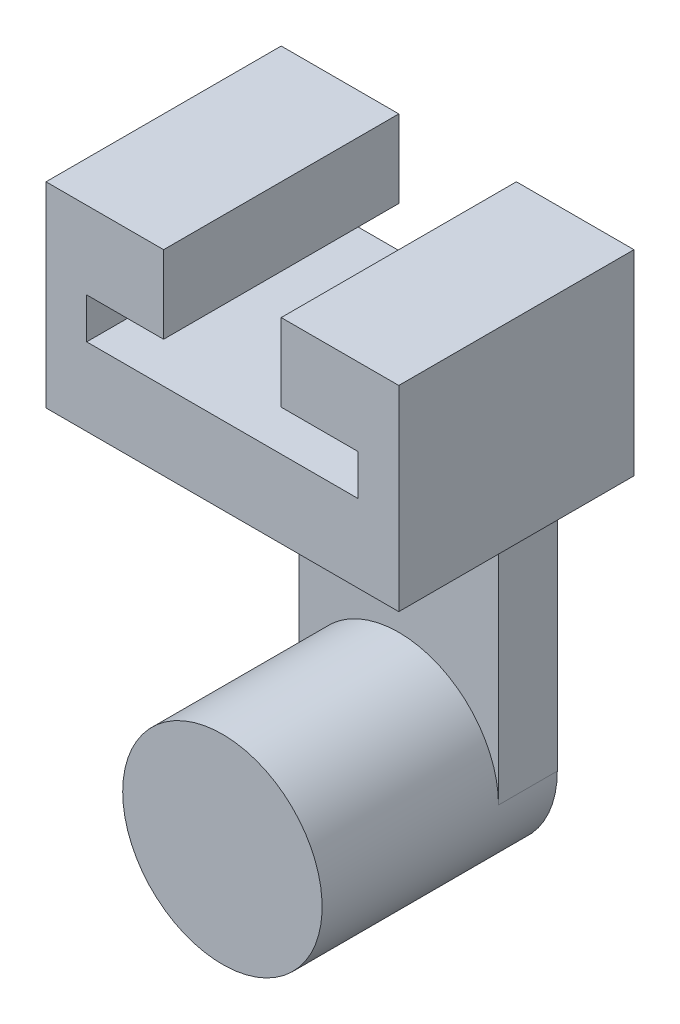
ISO-10303-21;
HEADER;
FILE_DESCRIPTION(('STEP AP214'),'2;1');
FILE_NAME('part.step','',(''),(''),'','','');
FILE_SCHEMA(('AUTOMOTIVE_DESIGN { 1 0 10303 214 1 1 1 1 }'));
ENDSEC;
DATA;
#1=APPLICATION_CONTEXT('core data for automotive mechanical design processes');
#2=APPLICATION_PROTOCOL_DEFINITION('international standard','automotive_design',2000,#1);
#3=PRODUCT_CONTEXT('',#1,'mechanical');
#4=PRODUCT('Part','Part','',(#3));
#5=PRODUCT_RELATED_PRODUCT_CATEGORY('part','',(#4));
#6=PRODUCT_DEFINITION_FORMATION('','',#4);
#7=PRODUCT_DEFINITION_CONTEXT('part definition',#1,'design');
#8=PRODUCT_DEFINITION('design','',#6,#7);
#9=PRODUCT_DEFINITION_SHAPE('','',#8);
#10=(LENGTH_UNIT() NAMED_UNIT(*) SI_UNIT(.MILLI.,.METRE.));
#11=(NAMED_UNIT(*) PLANE_ANGLE_UNIT() SI_UNIT($,.RADIAN.));
#12=(NAMED_UNIT(*) SI_UNIT($,.STERADIAN.) SOLID_ANGLE_UNIT());
#13=UNCERTAINTY_MEASURE_WITH_UNIT(LENGTH_MEASURE(1.E-05),#10,'distance_accuracy_value','');
#14=(GEOMETRIC_REPRESENTATION_CONTEXT(3) GLOBAL_UNCERTAINTY_ASSIGNED_CONTEXT((#13)) GLOBAL_UNIT_ASSIGNED_CONTEXT((#10,
#11,#12)) REPRESENTATION_CONTEXT('',''));
#15=CARTESIAN_POINT('',(0.,0.,0.));
#16=DIRECTION('',(0.,0.,1.));
#17=DIRECTION('',(1.,0.,0.));
#18=AXIS2_PLACEMENT_3D('',#15,#16,#17);
#19=CARTESIAN_POINT('',(-29.8196,0.,6.35));
#20=DIRECTION('',(-1.,0.,0.));
#21=DIRECTION('',(0.,-1.,0.));
#22=AXIS2_PLACEMENT_3D('',#19,#20,#21);
#23=PLANE('',#22);
#24=DIRECTION('',(0.,1.,0.));
#25=VECTOR('',#24,1.);
#26=CARTESIAN_POINT('',(-29.8196,0.,0.));
#27=LINE('',#26,#25);
#28=CARTESIAN_POINT('',(-29.8196,-31.75,0.));
#29=VERTEX_POINT('',#28);
#30=CARTESIAN_POINT('',(-29.8196,0.,0.));
#31=VERTEX_POINT('',#30);
#32=EDGE_CURVE('E84',#29,#31,#27,.T.);
#33=ORIENTED_EDGE('',*,*,#32,.F.);
#34=DIRECTION('',(0.,0.,-1.));
#35=VECTOR('',#34,1.);
#36=CARTESIAN_POINT('',(-29.8196,-31.75,6.35));
#37=LINE('',#36,#35);
#38=CARTESIAN_POINT('',(-29.8196,-31.75,6.35));
#39=VERTEX_POINT('',#38);
#40=EDGE_CURVE('E56',#39,#29,#37,.T.);
#41=ORIENTED_EDGE('',*,*,#40,.F.);
#42=DIRECTION('',(0.,1.,0.));
#43=VECTOR('',#42,1.);
#44=CARTESIAN_POINT('',(-29.8196,0.,6.35));
#45=LINE('',#44,#43);
#46=CARTESIAN_POINT('',(-29.8196,0.,6.35));
#47=VERTEX_POINT('',#46);
#48=EDGE_CURVE('E292',#39,#47,#45,.T.);
#49=ORIENTED_EDGE('',*,*,#48,.T.);
#50=DIRECTION('',(0.,0.,-1.));
#51=VECTOR('',#50,1.);
#52=CARTESIAN_POINT('',(-29.8196,0.,6.35));
#53=LINE('',#52,#51);
#54=EDGE_CURVE('E11',#47,#31,#53,.T.);
#55=ORIENTED_EDGE('',*,*,#54,.T.);
#56=EDGE_LOOP('',(#33,#41,#49,#55));
#57=FACE_BOUND('',#56,.T.);
#58=ADVANCED_FACE('F47',(#57),#23,.T.);
#59=CARTESIAN_POINT('',(-8.28040000000001,0.,6.35));
#60=DIRECTION('',(1.,0.,0.));
#61=DIRECTION('',(0.,1.,0.));
#62=AXIS2_PLACEMENT_3D('',#59,#60,#61);
#63=PLANE('',#62);
#64=DIRECTION('',(0.,-1.,0.));
#65=VECTOR('',#64,1.);
#66=CARTESIAN_POINT('',(-8.28040000000001,0.,0.));
#67=LINE('',#66,#65);
#68=CARTESIAN_POINT('',(-8.28040000000001,0.,0.));
#69=VERTEX_POINT('',#68);
#70=CARTESIAN_POINT('',(-8.2804,-31.75,0.));
#71=VERTEX_POINT('',#70);
#72=EDGE_CURVE('E287',#69,#71,#67,.T.);
#73=ORIENTED_EDGE('',*,*,#72,.F.);
#74=DIRECTION('',(0.,0.,-1.));
#75=VECTOR('',#74,1.);
#76=CARTESIAN_POINT('',(-8.28040000000001,0.,6.35));
#77=LINE('',#76,#75);
#78=CARTESIAN_POINT('',(-8.28040000000001,0.,6.35));
#79=VERTEX_POINT('',#78);
#80=EDGE_CURVE('E52',#79,#69,#77,.T.);
#81=ORIENTED_EDGE('',*,*,#80,.F.);
#82=DIRECTION('',(0.,-1.,0.));
#83=VECTOR('',#82,1.);
#84=CARTESIAN_POINT('',(-8.28040000000001,0.,6.35));
#85=LINE('',#84,#83);
#86=CARTESIAN_POINT('',(-8.2804,-31.75,6.35));
#87=VERTEX_POINT('',#86);
#88=EDGE_CURVE('E286',#79,#87,#85,.T.);
#89=ORIENTED_EDGE('',*,*,#88,.T.);
#90=DIRECTION('',(0.,0.,-1.));
#91=VECTOR('',#90,1.);
#92=CARTESIAN_POINT('',(-8.2804,-31.75,6.35));
#93=LINE('',#92,#91);
#94=EDGE_CURVE('E298',#87,#71,#93,.T.);
#95=ORIENTED_EDGE('',*,*,#94,.T.);
#96=EDGE_LOOP('',(#73,#81,#89,#95));
#97=FACE_BOUND('',#96,.T.);
#98=ADVANCED_FACE('F51',(#97),#63,.T.);
#99=CARTESIAN_POINT('',(0.,0.,6.35));
#100=DIRECTION('',(0.,0.,1.));
#101=DIRECTION('',(1.,0.,0.));
#102=AXIS2_PLACEMENT_3D('',#99,#100,#101);
#103=PLANE('',#102);
#104=CARTESIAN_POINT('',(-19.05,-31.75,6.35));
#105=DIRECTION('',(0.,0.,1.));
#106=DIRECTION('',(1.,0.,0.));
#107=AXIS2_PLACEMENT_3D('',#104,#105,#106);
#108=CIRCLE('',#107,10.7696);
#109=EDGE_CURVE('E282',#87,#39,#108,.T.);
#110=ORIENTED_EDGE('',*,*,#109,.F.);
#111=ORIENTED_EDGE('',*,*,#88,.F.);
#112=DIRECTION('',(1.,0.,0.));
#113=VECTOR('',#112,1.);
#114=CARTESIAN_POINT('',(-8.28040000000001,0.,6.35));
#115=LINE('',#114,#113);
#116=EDGE_CURVE('E67',#47,#79,#115,.T.);
#117=ORIENTED_EDGE('',*,*,#116,.F.);
#118=ORIENTED_EDGE('',*,*,#48,.F.);
#119=EDGE_LOOP('',(#110,#111,#117,#118));
#120=FACE_BOUND('',#119,.T.);
#121=ADVANCED_FACE('F323',(#120),#103,.T.);
#122=CARTESIAN_POINT('',(0.,0.,0.));
#123=DIRECTION('',(0.,0.,1.));
#124=DIRECTION('',(1.,0.,0.));
#125=AXIS2_PLACEMENT_3D('',#122,#123,#124);
#126=PLANE('',#125);
#127=ORIENTED_EDGE('',*,*,#72,.T.);
#128=CARTESIAN_POINT('',(-19.05,-31.75,0.));
#129=DIRECTION('',(0.,0.,-1.));
#130=DIRECTION('',(-1.,0.,0.));
#131=AXIS2_PLACEMENT_3D('',#128,#129,#130);
#132=CIRCLE('',#131,10.7696);
#133=EDGE_CURVE('E276',#71,#29,#132,.T.);
#134=ORIENTED_EDGE('',*,*,#133,.T.);
#135=ORIENTED_EDGE('',*,*,#32,.T.);
#136=DIRECTION('',(1.,0.,0.));
#137=VECTOR('',#136,1.);
#138=CARTESIAN_POINT('',(0.,0.,0.));
#139=LINE('',#138,#137);
#140=CARTESIAN_POINT('',(-38.1,0.,0.));
#141=VERTEX_POINT('',#140);
#142=EDGE_CURVE('E260',#141,#31,#139,.T.);
#143=ORIENTED_EDGE('',*,*,#142,.F.);
#144=DIRECTION('',(0.,-1.,0.));
#145=VECTOR('',#144,1.);
#146=CARTESIAN_POINT('',(-38.1,0.,0.));
#147=LINE('',#146,#145);
#148=CARTESIAN_POINT('',(-38.1,21.1582,0.));
#149=VERTEX_POINT('',#148);
#150=EDGE_CURVE('E270',#149,#141,#147,.T.);
#151=ORIENTED_EDGE('',*,*,#150,.F.);
#152=DIRECTION('',(-1.,0.,0.));
#153=VECTOR('',#152,1.);
#154=CARTESIAN_POINT('',(-38.1,21.1582,0.));
#155=LINE('',#154,#153);
#156=CARTESIAN_POINT('',(-25.4,21.1582,0.));
#157=VERTEX_POINT('',#156);
#158=EDGE_CURVE('E188',#157,#149,#155,.T.);
#159=ORIENTED_EDGE('',*,*,#158,.F.);
#160=DIRECTION('',(0.,1.,0.));
#161=VECTOR('',#160,1.);
#162=CARTESIAN_POINT('',(-25.4,12.7762,0.));
#163=LINE('',#162,#161);
#164=CARTESIAN_POINT('',(-25.4,12.7762,0.));
#165=VERTEX_POINT('',#164);
#166=EDGE_CURVE('E179',#165,#157,#163,.T.);
#167=ORIENTED_EDGE('',*,*,#166,.F.);
#168=DIRECTION('',(1.,0.,0.));
#169=VECTOR('',#168,1.);
#170=CARTESIAN_POINT('',(-38.1,12.7762,0.));
#171=LINE('',#170,#169);
#172=CARTESIAN_POINT('',(-33.7058,12.7762,0.));
#173=VERTEX_POINT('',#172);
#174=EDGE_CURVE('E169',#173,#165,#171,.T.);
#175=ORIENTED_EDGE('',*,*,#174,.F.);
#176=DIRECTION('',(0.,1.,0.));
#177=VECTOR('',#176,1.);
#178=CARTESIAN_POINT('',(-33.7058,8.382,0.));
#179=LINE('',#178,#177);
#180=CARTESIAN_POINT('',(-33.7058,8.382,0.));
#181=VERTEX_POINT('',#180);
#182=EDGE_CURVE('E231',#181,#173,#179,.T.);
#183=ORIENTED_EDGE('',*,*,#182,.F.);
#184=DIRECTION('',(-1.,0.,0.));
#185=VECTOR('',#184,1.);
#186=CARTESIAN_POINT('',(0.,8.382,0.));
#187=LINE('',#186,#185);
#188=CARTESIAN_POINT('',(-4.3942,8.382,0.));
#189=VERTEX_POINT('',#188);
#190=EDGE_CURVE('E268',#189,#181,#187,.T.);
#191=ORIENTED_EDGE('',*,*,#190,.F.);
#192=DIRECTION('',(0.,-1.,0.));
#193=VECTOR('',#192,1.);
#194=CARTESIAN_POINT('',(-4.3942,8.382,0.));
#195=LINE('',#194,#193);
#196=CARTESIAN_POINT('',(-4.3942,12.7762,0.));
#197=VERTEX_POINT('',#196);
#198=EDGE_CURVE('E250',#197,#189,#195,.T.);
#199=ORIENTED_EDGE('',*,*,#198,.F.);
#200=DIRECTION('',(1.,0.,0.));
#201=VECTOR('',#200,1.);
#202=CARTESIAN_POINT('',(0.,12.7762,0.));
#203=LINE('',#202,#201);
#204=CARTESIAN_POINT('',(-12.7,12.7762,0.));
#205=VERTEX_POINT('',#204);
#206=EDGE_CURVE('E215',#205,#197,#203,.T.);
#207=ORIENTED_EDGE('',*,*,#206,.F.);
#208=DIRECTION('',(0.,-1.,0.));
#209=VECTOR('',#208,1.);
#210=CARTESIAN_POINT('',(-12.7,12.7762,0.));
#211=LINE('',#210,#209);
#212=CARTESIAN_POINT('',(-12.7,21.1582,0.));
#213=VERTEX_POINT('',#212);
#214=EDGE_CURVE('E226',#213,#205,#211,.T.);
#215=ORIENTED_EDGE('',*,*,#214,.F.);
#216=DIRECTION('',(-1.,0.,0.));
#217=VECTOR('',#216,1.);
#218=CARTESIAN_POINT('',(0.,21.1582,0.));
#219=LINE('',#218,#217);
#220=CARTESIAN_POINT('',(0.,21.1582,0.));
#221=VERTEX_POINT('',#220);
#222=EDGE_CURVE('E223',#221,#213,#219,.T.);
#223=ORIENTED_EDGE('',*,*,#222,.F.);
#224=DIRECTION('',(0.,1.,0.));
#225=VECTOR('',#224,1.);
#226=CARTESIAN_POINT('',(0.,0.,0.));
#227=LINE('',#226,#225);
#228=CARTESIAN_POINT('',(0.,0.,0.));
#229=VERTEX_POINT('',#228);
#230=EDGE_CURVE('E241',#229,#221,#227,.T.);
#231=ORIENTED_EDGE('',*,*,#230,.F.);
#232=EDGE_CURVE('E272',#69,#229,#139,.T.);
#233=ORIENTED_EDGE('',*,*,#232,.F.);
#234=EDGE_LOOP('',(#127,#134,#135,#143,#151,#159,#167,#175,#183,#191,#199,#207,#215,#223,#231,#233));
#235=FACE_BOUND('',#234,.T.);
#236=ADVANCED_FACE('F194',(#235),#126,.F.);
#237=CARTESIAN_POINT('',(-19.05,-31.75,25.4));
#238=DIRECTION('',(0.,0.,-1.));
#239=DIRECTION('',(-1.,0.,0.));
#240=AXIS2_PLACEMENT_3D('',#237,#238,#239);
#241=CYLINDRICAL_SURFACE('',#240,10.7696);
#242=ORIENTED_EDGE('',*,*,#109,.T.);
#243=ORIENTED_EDGE('',*,*,#40,.T.);
#244=ORIENTED_EDGE('',*,*,#133,.F.);
#245=ORIENTED_EDGE('',*,*,#94,.F.);
#246=EDGE_LOOP('',(#242,#243,#244,#245));
#247=FACE_BOUND('',#246,.T.);
#248=CARTESIAN_POINT('',(-19.05,-31.75,25.4));
#249=DIRECTION('',(0.,0.,-1.));
#250=DIRECTION('',(-1.,0.,0.));
#251=AXIS2_PLACEMENT_3D('',#248,#249,#250);
#252=CIRCLE('',#251,10.7696);
#253=CARTESIAN_POINT('',(-29.8196,-31.75,25.4));
#254=VERTEX_POINT('',#253);
#255=EDGE_CURVE('E278',#254,#254,#252,.T.);
#256=ORIENTED_EDGE('',*,*,#255,.T.);
#257=EDGE_LOOP('',(#256));
#258=FACE_BOUND('',#257,.T.);
#259=ADVANCED_FACE('F324',(#247,#258),#241,.T.);
#260=CARTESIAN_POINT('',(-19.05,-31.75,25.4));
#261=DIRECTION('',(0.,0.,-1.));
#262=DIRECTION('',(-1.,0.,0.));
#263=AXIS2_PLACEMENT_3D('',#260,#261,#262);
#264=PLANE('',#263);
#265=ORIENTED_EDGE('',*,*,#255,.F.);
#266=EDGE_LOOP('',(#265));
#267=FACE_BOUND('',#266,.T.);
#268=ADVANCED_FACE('F340',(#267),#264,.F.);
#269=CARTESIAN_POINT('',(0.,8.382,25.4));
#270=DIRECTION('',(0.,-1.,0.));
#271=DIRECTION('',(1.,0.,0.));
#272=AXIS2_PLACEMENT_3D('',#269,#270,#271);
#273=PLANE('',#272);
#274=ORIENTED_EDGE('',*,*,#190,.T.);
#275=DIRECTION('',(0.,0.,1.));
#276=VECTOR('',#275,1.);
#277=CARTESIAN_POINT('',(-33.7058,8.382,0.));
#278=LINE('',#277,#276);
#279=CARTESIAN_POINT('',(-33.7058,8.382,25.4));
#280=VERTEX_POINT('',#279);
#281=EDGE_CURVE('E232',#181,#280,#278,.T.);
#282=ORIENTED_EDGE('',*,*,#281,.T.);
#283=DIRECTION('',(-1.,0.,0.));
#284=VECTOR('',#283,1.);
#285=CARTESIAN_POINT('',(0.,8.382,25.4));
#286=LINE('',#285,#284);
#287=CARTESIAN_POINT('',(-4.3942,8.382,25.4));
#288=VERTEX_POINT('',#287);
#289=EDGE_CURVE('E257',#288,#280,#286,.T.);
#290=ORIENTED_EDGE('',*,*,#289,.F.);
#291=DIRECTION('',(0.,0.,1.));
#292=VECTOR('',#291,1.);
#293=CARTESIAN_POINT('',(-4.3942,8.382,0.));
#294=LINE('',#293,#292);
#295=EDGE_CURVE('E210',#189,#288,#294,.T.);
#296=ORIENTED_EDGE('',*,*,#295,.F.);
#297=EDGE_LOOP('',(#274,#282,#290,#296));
#298=FACE_BOUND('',#297,.T.);
#299=ADVANCED_FACE('F338',(#298),#273,.F.);
#300=CARTESIAN_POINT('',(0.,0.,25.4));
#301=DIRECTION('',(-1.,0.,0.));
#302=DIRECTION('',(0.,0.,1.));
#303=AXIS2_PLACEMENT_3D('',#300,#301,#302);
#304=PLANE('',#303);
#305=ORIENTED_EDGE('',*,*,#230,.T.);
#306=DIRECTION('',(0.,0.,1.));
#307=VECTOR('',#306,1.);
#308=CARTESIAN_POINT('',(0.,21.1582,0.));
#309=LINE('',#308,#307);
#310=CARTESIAN_POINT('',(0.,21.1582,25.4));
#311=VERTEX_POINT('',#310);
#312=EDGE_CURVE('E209',#221,#311,#309,.T.);
#313=ORIENTED_EDGE('',*,*,#312,.T.);
#314=DIRECTION('',(0.,1.,0.));
#315=VECTOR('',#314,1.);
#316=CARTESIAN_POINT('',(0.,0.,25.4));
#317=LINE('',#316,#315);
#318=CARTESIAN_POINT('',(0.,0.,25.4));
#319=VERTEX_POINT('',#318);
#320=EDGE_CURVE('E251',#319,#311,#317,.T.);
#321=ORIENTED_EDGE('',*,*,#320,.F.);
#322=DIRECTION('',(0.,0.,-1.));
#323=VECTOR('',#322,1.);
#324=CARTESIAN_POINT('',(0.,0.,25.4));
#325=LINE('',#324,#323);
#326=EDGE_CURVE('E265',#319,#229,#325,.T.);
#327=ORIENTED_EDGE('',*,*,#326,.T.);
#328=EDGE_LOOP('',(#305,#313,#321,#327));
#329=FACE_BOUND('',#328,.T.);
#330=ADVANCED_FACE('F308',(#329),#304,.F.);
#331=CARTESIAN_POINT('',(-38.1,0.,25.4));
#332=DIRECTION('',(1.,0.,0.));
#333=DIRECTION('',(0.,0.,-1.));
#334=AXIS2_PLACEMENT_3D('',#331,#332,#333);
#335=PLANE('',#334);
#336=ORIENTED_EDGE('',*,*,#150,.T.);
#337=DIRECTION('',(0.,0.,-1.));
#338=VECTOR('',#337,1.);
#339=CARTESIAN_POINT('',(-38.1,0.,25.4));
#340=LINE('',#339,#338);
#341=CARTESIAN_POINT('',(-38.1,0.,25.4));
#342=VERTEX_POINT('',#341);
#343=EDGE_CURVE('E277',#342,#141,#340,.T.);
#344=ORIENTED_EDGE('',*,*,#343,.F.);
#345=DIRECTION('',(0.,-1.,0.));
#346=VECTOR('',#345,1.);
#347=CARTESIAN_POINT('',(-38.1,0.,25.4));
#348=LINE('',#347,#346);
#349=CARTESIAN_POINT('',(-38.1,21.1582,25.4));
#350=VERTEX_POINT('',#349);
#351=EDGE_CURVE('E258',#350,#342,#348,.T.);
#352=ORIENTED_EDGE('',*,*,#351,.F.);
#353=DIRECTION('',(0.,0.,1.));
#354=VECTOR('',#353,1.);
#355=CARTESIAN_POINT('',(-38.1,21.1582,0.));
#356=LINE('',#355,#354);
#357=EDGE_CURVE('E205',#149,#350,#356,.T.);
#358=ORIENTED_EDGE('',*,*,#357,.F.);
#359=EDGE_LOOP('',(#336,#344,#352,#358));
#360=FACE_BOUND('',#359,.T.);
#361=ADVANCED_FACE('F341',(#360),#335,.F.);
#362=CARTESIAN_POINT('',(0.,0.,25.4));
#363=DIRECTION('',(0.,1.,0.));
#364=DIRECTION('',(-1.,0.,0.));
#365=AXIS2_PLACEMENT_3D('',#362,#363,#364);
#366=PLANE('',#365);
#367=ORIENTED_EDGE('',*,*,#54,.F.);
#368=ORIENTED_EDGE('',*,*,#116,.T.);
#369=ORIENTED_EDGE('',*,*,#80,.T.);
#370=ORIENTED_EDGE('',*,*,#232,.T.);
#371=ORIENTED_EDGE('',*,*,#326,.F.);
#372=DIRECTION('',(1.,0.,0.));
#373=VECTOR('',#372,1.);
#374=CARTESIAN_POINT('',(0.,0.,25.4));
#375=LINE('',#374,#373);
#376=EDGE_CURVE('E264',#342,#319,#375,.T.);
#377=ORIENTED_EDGE('',*,*,#376,.F.);
#378=ORIENTED_EDGE('',*,*,#343,.T.);
#379=ORIENTED_EDGE('',*,*,#142,.T.);
#380=EDGE_LOOP('',(#367,#368,#369,#370,#371,#377,#378,#379));
#381=FACE_BOUND('',#380,.T.);
#382=ADVANCED_FACE('F297',(#381),#366,.F.);
#383=CARTESIAN_POINT('',(0.,0.,25.4));
#384=DIRECTION('',(0.,0.,1.));
#385=DIRECTION('',(1.,0.,0.));
#386=AXIS2_PLACEMENT_3D('',#383,#384,#385);
#387=PLANE('',#386);
#388=ORIENTED_EDGE('',*,*,#320,.T.);
#389=DIRECTION('',(-1.,0.,0.));
#390=VECTOR('',#389,1.);
#391=CARTESIAN_POINT('',(0.,21.1582,25.4));
#392=LINE('',#391,#390);
#393=CARTESIAN_POINT('',(-12.7,21.1582,25.4));
#394=VERTEX_POINT('',#393);
#395=EDGE_CURVE('E196',#311,#394,#392,.T.);
#396=ORIENTED_EDGE('',*,*,#395,.T.);
#397=DIRECTION('',(0.,-1.,0.));
#398=VECTOR('',#397,1.);
#399=CARTESIAN_POINT('',(-12.7,12.7762,25.4));
#400=LINE('',#399,#398);
#401=CARTESIAN_POINT('',(-12.7,12.7762,25.4));
#402=VERTEX_POINT('',#401);
#403=EDGE_CURVE('E216',#394,#402,#400,.T.);
#404=ORIENTED_EDGE('',*,*,#403,.T.);
#405=DIRECTION('',(1.,0.,0.));
#406=VECTOR('',#405,1.);
#407=CARTESIAN_POINT('',(0.,12.7762,25.4));
#408=LINE('',#407,#406);
#409=CARTESIAN_POINT('',(-4.3942,12.7762,25.4));
#410=VERTEX_POINT('',#409);
#411=EDGE_CURVE('E219',#402,#410,#408,.T.);
#412=ORIENTED_EDGE('',*,*,#411,.T.);
#413=DIRECTION('',(0.,-1.,0.));
#414=VECTOR('',#413,1.);
#415=CARTESIAN_POINT('',(-4.3942,8.382,25.4));
#416=LINE('',#415,#414);
#417=EDGE_CURVE('E237',#410,#288,#416,.T.);
#418=ORIENTED_EDGE('',*,*,#417,.T.);
#419=ORIENTED_EDGE('',*,*,#289,.T.);
#420=DIRECTION('',(0.,1.,0.));
#421=VECTOR('',#420,1.);
#422=CARTESIAN_POINT('',(-33.7058,8.382,25.4));
#423=LINE('',#422,#421);
#424=CARTESIAN_POINT('',(-33.7058,12.7762,25.4));
#425=VERTEX_POINT('',#424);
#426=EDGE_CURVE('E236',#280,#425,#423,.T.);
#427=ORIENTED_EDGE('',*,*,#426,.T.);
#428=DIRECTION('',(1.,0.,0.));
#429=VECTOR('',#428,1.);
#430=CARTESIAN_POINT('',(-38.1,12.7762,25.4));
#431=LINE('',#430,#429);
#432=CARTESIAN_POINT('',(-25.4,12.7762,25.4));
#433=VERTEX_POINT('',#432);
#434=EDGE_CURVE('E197',#425,#433,#431,.T.);
#435=ORIENTED_EDGE('',*,*,#434,.T.);
#436=DIRECTION('',(0.,1.,0.));
#437=VECTOR('',#436,1.);
#438=CARTESIAN_POINT('',(-25.4,12.7762,25.4));
#439=LINE('',#438,#437);
#440=CARTESIAN_POINT('',(-25.4,21.1582,25.4));
#441=VERTEX_POINT('',#440);
#442=EDGE_CURVE('E189',#433,#441,#439,.T.);
#443=ORIENTED_EDGE('',*,*,#442,.T.);
#444=DIRECTION('',(-1.,0.,0.));
#445=VECTOR('',#444,1.);
#446=CARTESIAN_POINT('',(-38.1,21.1582,25.4));
#447=LINE('',#446,#445);
#448=EDGE_CURVE('E181',#441,#350,#447,.T.);
#449=ORIENTED_EDGE('',*,*,#448,.T.);
#450=ORIENTED_EDGE('',*,*,#351,.T.);
#451=ORIENTED_EDGE('',*,*,#376,.T.);
#452=EDGE_LOOP('',(#388,#396,#404,#412,#418,#419,#427,#435,#443,#449,#450,#451));
#453=FACE_BOUND('',#452,.T.);
#454=ADVANCED_FACE('F314',(#453),#387,.T.);
#455=CARTESIAN_POINT('',(-4.3942,8.382,0.));
#456=DIRECTION('',(-1.,0.,0.));
#457=DIRECTION('',(0.,0.,1.));
#458=AXIS2_PLACEMENT_3D('',#455,#456,#457);
#459=PLANE('',#458);
#460=ORIENTED_EDGE('',*,*,#417,.F.);
#461=DIRECTION('',(0.,0.,1.));
#462=VECTOR('',#461,1.);
#463=CARTESIAN_POINT('',(-4.3942,12.7762,0.));
#464=LINE('',#463,#462);
#465=EDGE_CURVE('E242',#197,#410,#464,.T.);
#466=ORIENTED_EDGE('',*,*,#465,.F.);
#467=ORIENTED_EDGE('',*,*,#198,.T.);
#468=ORIENTED_EDGE('',*,*,#295,.T.);
#469=EDGE_LOOP('',(#460,#466,#467,#468));
#470=FACE_BOUND('',#469,.T.);
#471=ADVANCED_FACE('F355',(#470),#459,.T.);
#472=CARTESIAN_POINT('',(-33.7058,8.382,0.));
#473=DIRECTION('',(1.,0.,0.));
#474=DIRECTION('',(0.,0.,-1.));
#475=AXIS2_PLACEMENT_3D('',#472,#473,#474);
#476=PLANE('',#475);
#477=ORIENTED_EDGE('',*,*,#426,.F.);
#478=ORIENTED_EDGE('',*,*,#281,.F.);
#479=ORIENTED_EDGE('',*,*,#182,.T.);
#480=DIRECTION('',(0.,0.,1.));
#481=VECTOR('',#480,1.);
#482=CARTESIAN_POINT('',(-33.7058,12.7762,0.));
#483=LINE('',#482,#481);
#484=EDGE_CURVE('E174',#173,#425,#483,.T.);
#485=ORIENTED_EDGE('',*,*,#484,.T.);
#486=EDGE_LOOP('',(#477,#478,#479,#485));
#487=FACE_BOUND('',#486,.T.);
#488=ADVANCED_FACE('F357',(#487),#476,.T.);
#489=CARTESIAN_POINT('',(-38.1,12.7762,0.));
#490=DIRECTION('',(0.,-1.,0.));
#491=DIRECTION('',(0.,0.,-1.));
#492=AXIS2_PLACEMENT_3D('',#489,#490,#491);
#493=PLANE('',#492);
#494=ORIENTED_EDGE('',*,*,#484,.F.);
#495=ORIENTED_EDGE('',*,*,#174,.T.);
#496=DIRECTION('',(0.,0.,1.));
#497=VECTOR('',#496,1.);
#498=CARTESIAN_POINT('',(-25.4,12.7762,0.));
#499=LINE('',#498,#497);
#500=EDGE_CURVE('E175',#165,#433,#499,.T.);
#501=ORIENTED_EDGE('',*,*,#500,.T.);
#502=ORIENTED_EDGE('',*,*,#434,.F.);
#503=EDGE_LOOP('',(#494,#495,#501,#502));
#504=FACE_BOUND('',#503,.T.);
#505=ADVANCED_FACE('F171',(#504),#493,.T.);
#506=CARTESIAN_POINT('',(-38.1,21.1582,0.));
#507=DIRECTION('',(0.,1.,0.));
#508=DIRECTION('',(0.,0.,1.));
#509=AXIS2_PLACEMENT_3D('',#506,#507,#508);
#510=PLANE('',#509);
#511=ORIENTED_EDGE('',*,*,#448,.F.);
#512=DIRECTION('',(0.,0.,1.));
#513=VECTOR('',#512,1.);
#514=CARTESIAN_POINT('',(-25.4,21.1582,0.));
#515=LINE('',#514,#513);
#516=EDGE_CURVE('E186',#157,#441,#515,.T.);
#517=ORIENTED_EDGE('',*,*,#516,.F.);
#518=ORIENTED_EDGE('',*,*,#158,.T.);
#519=ORIENTED_EDGE('',*,*,#357,.T.);
#520=EDGE_LOOP('',(#511,#517,#518,#519));
#521=FACE_BOUND('',#520,.T.);
#522=ADVANCED_FACE('F372',(#521),#510,.T.);
#523=CARTESIAN_POINT('',(-25.4,12.7762,0.));
#524=DIRECTION('',(1.,0.,0.));
#525=DIRECTION('',(0.,0.,-1.));
#526=AXIS2_PLACEMENT_3D('',#523,#524,#525);
#527=PLANE('',#526);
#528=ORIENTED_EDGE('',*,*,#442,.F.);
#529=ORIENTED_EDGE('',*,*,#500,.F.);
#530=ORIENTED_EDGE('',*,*,#166,.T.);
#531=ORIENTED_EDGE('',*,*,#516,.T.);
#532=EDGE_LOOP('',(#528,#529,#530,#531));
#533=FACE_BOUND('',#532,.T.);
#534=ADVANCED_FACE('F184',(#533),#527,.T.);
#535=CARTESIAN_POINT('',(0.,12.7762,0.));
#536=DIRECTION('',(0.,-1.,0.));
#537=DIRECTION('',(1.,0.,0.));
#538=AXIS2_PLACEMENT_3D('',#535,#536,#537);
#539=PLANE('',#538);
#540=ORIENTED_EDGE('',*,*,#206,.T.);
#541=ORIENTED_EDGE('',*,*,#465,.T.);
#542=ORIENTED_EDGE('',*,*,#411,.F.);
#543=DIRECTION('',(0.,0.,1.));
#544=VECTOR('',#543,1.);
#545=CARTESIAN_POINT('',(-12.7,12.7762,0.));
#546=LINE('',#545,#544);
#547=EDGE_CURVE('E213',#205,#402,#546,.T.);
#548=ORIENTED_EDGE('',*,*,#547,.F.);
#549=EDGE_LOOP('',(#540,#541,#542,#548));
#550=FACE_BOUND('',#549,.T.);
#551=ADVANCED_FACE('F365',(#550),#539,.T.);
#552=CARTESIAN_POINT('',(-12.7,12.7762,0.));
#553=DIRECTION('',(-1.,0.,0.));
#554=DIRECTION('',(0.,-1.,0.));
#555=AXIS2_PLACEMENT_3D('',#552,#553,#554);
#556=PLANE('',#555);
#557=ORIENTED_EDGE('',*,*,#403,.F.);
#558=DIRECTION('',(0.,0.,1.));
#559=VECTOR('',#558,1.);
#560=CARTESIAN_POINT('',(-12.7,21.1582,0.));
#561=LINE('',#560,#559);
#562=EDGE_CURVE('E214',#213,#394,#561,.T.);
#563=ORIENTED_EDGE('',*,*,#562,.F.);
#564=ORIENTED_EDGE('',*,*,#214,.T.);
#565=ORIENTED_EDGE('',*,*,#547,.T.);
#566=EDGE_LOOP('',(#557,#563,#564,#565));
#567=FACE_BOUND('',#566,.T.);
#568=ADVANCED_FACE('F362',(#567),#556,.T.);
#569=CARTESIAN_POINT('',(0.,21.1582,0.));
#570=DIRECTION('',(0.,1.,0.));
#571=DIRECTION('',(0.,0.,1.));
#572=AXIS2_PLACEMENT_3D('',#569,#570,#571);
#573=PLANE('',#572);
#574=ORIENTED_EDGE('',*,*,#395,.F.);
#575=ORIENTED_EDGE('',*,*,#312,.F.);
#576=ORIENTED_EDGE('',*,*,#222,.T.);
#577=ORIENTED_EDGE('',*,*,#562,.T.);
#578=EDGE_LOOP('',(#574,#575,#576,#577));
#579=FACE_BOUND('',#578,.T.);
#580=ADVANCED_FACE('F315',(#579),#573,.T.);
#581=CLOSED_SHELL('',(#58,#98,#121,#236,#259,#268,#299,#330,#361,#382,#454,#471,#488,#505,#522,
#534,#551,#568,#580));
#582=MANIFOLD_SOLID_BREP('B2',#581);
#583=ADVANCED_BREP_SHAPE_REPRESENTATION('',(#18,#582),#14);
#584=SHAPE_DEFINITION_REPRESENTATION(#9,#583);
ENDSEC;
END-ISO-10303-21;
